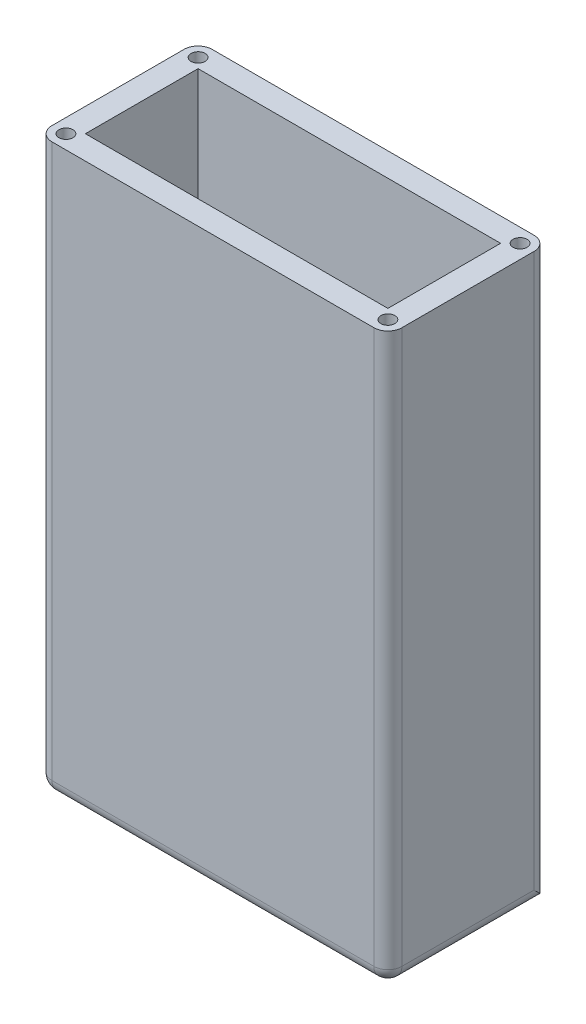
ISO-10303-21;
HEADER;
FILE_DESCRIPTION(('STEP AP214'),'2;1');
FILE_NAME('part.step','',(''),(''),'','','');
FILE_SCHEMA(('AUTOMOTIVE_DESIGN { 1 0 10303 214 1 1 1 1 }'));
ENDSEC;
DATA;
#1=APPLICATION_CONTEXT('core data for automotive mechanical design processes');
#2=APPLICATION_PROTOCOL_DEFINITION('international standard','automotive_design',2000,#1);
#3=PRODUCT_CONTEXT('',#1,'mechanical');
#4=PRODUCT('Part','Part','',(#3));
#5=PRODUCT_RELATED_PRODUCT_CATEGORY('part','',(#4));
#6=PRODUCT_DEFINITION_FORMATION('','',#4);
#7=PRODUCT_DEFINITION_CONTEXT('part definition',#1,'design');
#8=PRODUCT_DEFINITION('design','',#6,#7);
#9=PRODUCT_DEFINITION_SHAPE('','',#8);
#10=(LENGTH_UNIT() NAMED_UNIT(*) SI_UNIT(.MILLI.,.METRE.));
#11=(NAMED_UNIT(*) PLANE_ANGLE_UNIT() SI_UNIT($,.RADIAN.));
#12=(NAMED_UNIT(*) SI_UNIT($,.STERADIAN.) SOLID_ANGLE_UNIT());
#13=UNCERTAINTY_MEASURE_WITH_UNIT(LENGTH_MEASURE(1.E-05),#10,'distance_accuracy_value','');
#14=(GEOMETRIC_REPRESENTATION_CONTEXT(3) GLOBAL_UNCERTAINTY_ASSIGNED_CONTEXT((#13)) GLOBAL_UNIT_ASSIGNED_CONTEXT((#10,
#11,#12)) REPRESENTATION_CONTEXT('',''));
#15=CARTESIAN_POINT('',(0.,0.,0.));
#16=DIRECTION('',(0.,0.,1.));
#17=DIRECTION('',(1.,0.,0.));
#18=AXIS2_PLACEMENT_3D('',#15,#16,#17);
#19=CARTESIAN_POINT('',(0.,87.122,-34.29));
#20=DIRECTION('',(0.,0.,1.));
#21=DIRECTION('',(1.,0.,0.));
#22=AXIS2_PLACEMENT_3D('',#19,#20,#21);
#23=PLANE('',#22);
#24=DIRECTION('',(-1.,0.,0.));
#25=VECTOR('',#24,1.);
#26=CARTESIAN_POINT('',(0.,121.412,-34.29));
#27=LINE('',#26,#25);
#28=CARTESIAN_POINT('',(71.93,121.412,-34.29));
#29=VERTEX_POINT('',#28);
#30=CARTESIAN_POINT('',(3.,121.412,-34.29));
#31=VERTEX_POINT('',#30);
#32=EDGE_CURVE('E260',#29,#31,#27,.T.);
#33=ORIENTED_EDGE('',*,*,#32,.F.);
#34=DIRECTION('',(0.,-1.,0.));
#35=VECTOR('',#34,1.);
#36=CARTESIAN_POINT('',(71.93,87.122,-34.29));
#37=LINE('',#36,#35);
#38=CARTESIAN_POINT('',(71.93,84.582,-34.29));
#39=VERTEX_POINT('',#38);
#40=EDGE_CURVE('E328',#29,#39,#37,.T.);
#41=ORIENTED_EDGE('',*,*,#40,.T.);
#42=DIRECTION('',(-1.,0.,0.));
#43=VECTOR('',#42,1.);
#44=CARTESIAN_POINT('',(0.,84.582,-34.29));
#45=LINE('',#44,#43);
#46=CARTESIAN_POINT('',(3.,84.582,-34.29));
#47=VERTEX_POINT('',#46);
#48=EDGE_CURVE('E279',#39,#47,#45,.T.);
#49=ORIENTED_EDGE('',*,*,#48,.T.);
#50=DIRECTION('',(0.,-1.,0.));
#51=VECTOR('',#50,1.);
#52=CARTESIAN_POINT('',(3.,87.122,-34.29));
#53=LINE('',#52,#51);
#54=EDGE_CURVE('E322',#47,#31,#53,.F.);
#55=ORIENTED_EDGE('',*,*,#54,.T.);
#56=EDGE_LOOP('',(#33,#41,#49,#55));
#57=FACE_BOUND('',#56,.T.);
#58=ADVANCED_FACE('F33',(#57),#23,.F.);
#59=CARTESIAN_POINT('',(0.,89.662,0.));
#60=DIRECTION('',(0.,-1.,0.));
#61=DIRECTION('',(0.,0.,-1.));
#62=AXIS2_PLACEMENT_3D('',#59,#60,#61);
#63=PLANE('',#62);
#64=DIRECTION('',(0.,0.,-1.));
#65=VECTOR('',#64,1.);
#66=CARTESIAN_POINT('',(34.925,89.662,-5.08));
#67=LINE('',#66,#65);
#68=CARTESIAN_POINT('',(34.925,89.662,-5.08));
#69=VERTEX_POINT('',#68);
#70=CARTESIAN_POINT('',(34.925,89.662,-14.605));
#71=VERTEX_POINT('',#70);
#72=EDGE_CURVE('E220',#69,#71,#67,.T.);
#73=ORIENTED_EDGE('',*,*,#72,.F.);
#74=DIRECTION('',(1.,0.,0.));
#75=VECTOR('',#74,1.);
#76=CARTESIAN_POINT('',(0.,89.662,-5.08));
#77=LINE('',#76,#75);
#78=CARTESIAN_POINT('',(69.85,89.662,-5.08));
#79=VERTEX_POINT('',#78);
#80=EDGE_CURVE('E233',#69,#79,#77,.T.);
#81=ORIENTED_EDGE('',*,*,#80,.T.);
#82=DIRECTION('',(0.,0.,-1.));
#83=VECTOR('',#82,1.);
#84=CARTESIAN_POINT('',(69.85,89.662,0.));
#85=LINE('',#84,#83);
#86=CARTESIAN_POINT('',(69.85,89.662,-12.08));
#87=VERTEX_POINT('',#86);
#88=EDGE_CURVE('E244',#79,#87,#85,.T.);
#89=ORIENTED_EDGE('',*,*,#88,.T.);
#90=DIRECTION('',(1.,0.,0.));
#91=VECTOR('',#90,1.);
#92=CARTESIAN_POINT('',(69.85,89.662,-12.08));
#93=LINE('',#92,#91);
#94=CARTESIAN_POINT('',(64.85,89.662,-12.08));
#95=VERTEX_POINT('',#94);
#96=EDGE_CURVE('E393',#95,#87,#93,.T.);
#97=ORIENTED_EDGE('',*,*,#96,.F.);
#98=DIRECTION('',(0.,0.,1.));
#99=VECTOR('',#98,1.);
#100=CARTESIAN_POINT('',(64.85,89.662,-22.21));
#101=LINE('',#100,#99);
#102=CARTESIAN_POINT('',(64.85,89.662,-22.21));
#103=VERTEX_POINT('',#102);
#104=EDGE_CURVE('E408',#103,#95,#101,.T.);
#105=ORIENTED_EDGE('',*,*,#104,.F.);
#106=DIRECTION('',(-1.,0.,0.));
#107=VECTOR('',#106,1.);
#108=CARTESIAN_POINT('',(69.85,89.662,-22.21));
#109=LINE('',#108,#107);
#110=CARTESIAN_POINT('',(69.85,89.662,-22.21));
#111=VERTEX_POINT('',#110);
#112=EDGE_CURVE('E410',#111,#103,#109,.T.);
#113=ORIENTED_EDGE('',*,*,#112,.F.);
#114=CARTESIAN_POINT('',(69.85,89.662,-29.21));
#115=VERTEX_POINT('',#114);
#116=EDGE_CURVE('E248',#111,#115,#85,.T.);
#117=ORIENTED_EDGE('',*,*,#116,.T.);
#118=DIRECTION('',(-1.,0.,0.));
#119=VECTOR('',#118,1.);
#120=CARTESIAN_POINT('',(0.,89.662,-29.21));
#121=LINE('',#120,#119);
#122=CARTESIAN_POINT('',(5.08,89.662,-29.21));
#123=VERTEX_POINT('',#122);
#124=EDGE_CURVE('E432',#115,#123,#121,.T.);
#125=ORIENTED_EDGE('',*,*,#124,.T.);
#126=DIRECTION('',(0.,0.,-1.));
#127=VECTOR('',#126,1.);
#128=CARTESIAN_POINT('',(5.08,89.662,0.));
#129=LINE('',#128,#127);
#130=CARTESIAN_POINT('',(5.08,89.662,-5.08));
#131=VERTEX_POINT('',#130);
#132=EDGE_CURVE('E441',#131,#123,#129,.T.);
#133=ORIENTED_EDGE('',*,*,#132,.F.);
#134=CARTESIAN_POINT('',(22.225,89.662,-5.08));
#135=VERTEX_POINT('',#134);
#136=EDGE_CURVE('E243',#131,#135,#77,.T.);
#137=ORIENTED_EDGE('',*,*,#136,.T.);
#138=DIRECTION('',(0.,0.,1.));
#139=VECTOR('',#138,1.);
#140=CARTESIAN_POINT('',(22.225,89.662,-5.08));
#141=LINE('',#140,#139);
#142=CARTESIAN_POINT('',(22.225,89.662,-14.605));
#143=VERTEX_POINT('',#142);
#144=EDGE_CURVE('E386',#143,#135,#141,.T.);
#145=ORIENTED_EDGE('',*,*,#144,.F.);
#146=DIRECTION('',(-1.,0.,0.));
#147=VECTOR('',#146,1.);
#148=CARTESIAN_POINT('',(34.925,89.662,-14.605));
#149=LINE('',#148,#147);
#150=EDGE_CURVE('E236',#71,#143,#149,.T.);
#151=ORIENTED_EDGE('',*,*,#150,.F.);
#152=EDGE_LOOP('',(#73,#81,#89,#97,#105,#113,#117,#125,#133,#137,#145,#151));
#153=FACE_BOUND('',#152,.T.);
#154=ADVANCED_FACE('F231',(#153),#63,.F.);
#155=CARTESIAN_POINT('',(0.,121.412,0.));
#156=DIRECTION('',(0.,-1.,0.));
#157=DIRECTION('',(0.,0.,-1.));
#158=AXIS2_PLACEMENT_3D('',#155,#156,#157);
#159=PLANE('',#158);
#160=CARTESIAN_POINT('',(71.93,121.412,-31.29));
#161=DIRECTION('',(0.,1.,0.));
#162=DIRECTION('',(0.,0.,1.));
#163=AXIS2_PLACEMENT_3D('',#160,#161,#162);
#164=CIRCLE('',#163,1.5);
#165=CARTESIAN_POINT('',(71.93,121.412,-29.79));
#166=VERTEX_POINT('',#165);
#167=EDGE_CURVE('E359',#166,#166,#164,.T.);
#168=ORIENTED_EDGE('',*,*,#167,.F.);
#169=EDGE_LOOP('',(#168));
#170=FACE_BOUND('',#169,.T.);
#171=CARTESIAN_POINT('',(71.93,121.412,-3.));
#172=DIRECTION('',(0.,1.,0.));
#173=DIRECTION('',(0.,0.,1.));
#174=AXIS2_PLACEMENT_3D('',#171,#172,#173);
#175=CIRCLE('',#174,1.5);
#176=CARTESIAN_POINT('',(71.93,121.412,-1.5));
#177=VERTEX_POINT('',#176);
#178=EDGE_CURVE('E370',#177,#177,#175,.T.);
#179=ORIENTED_EDGE('',*,*,#178,.F.);
#180=EDGE_LOOP('',(#179));
#181=FACE_BOUND('',#180,.T.);
#182=CARTESIAN_POINT('',(3.,121.412,-3.));
#183=DIRECTION('',(0.,1.,0.));
#184=DIRECTION('',(0.,0.,1.));
#185=AXIS2_PLACEMENT_3D('',#182,#183,#184);
#186=CIRCLE('',#185,1.5);
#187=CARTESIAN_POINT('',(3.,121.412,-1.5));
#188=VERTEX_POINT('',#187);
#189=EDGE_CURVE('E632',#188,#188,#186,.T.);
#190=ORIENTED_EDGE('',*,*,#189,.F.);
#191=EDGE_LOOP('',(#190));
#192=FACE_BOUND('',#191,.T.);
#193=CARTESIAN_POINT('',(3.,121.412,-31.29));
#194=DIRECTION('',(0.,1.,0.));
#195=DIRECTION('',(0.,0.,1.));
#196=AXIS2_PLACEMENT_3D('',#193,#194,#195);
#197=CIRCLE('',#196,1.5);
#198=CARTESIAN_POINT('',(3.,121.412,-29.79));
#199=VERTEX_POINT('',#198);
#200=EDGE_CURVE('E378',#199,#199,#197,.T.);
#201=ORIENTED_EDGE('',*,*,#200,.F.);
#202=EDGE_LOOP('',(#201));
#203=FACE_BOUND('',#202,.T.);
#204=DIRECTION('',(1.,0.,0.));
#205=VECTOR('',#204,1.);
#206=CARTESIAN_POINT('',(0.,121.412,0.));
#207=LINE('',#206,#205);
#208=CARTESIAN_POINT('',(3.,121.412,0.));
#209=VERTEX_POINT('',#208);
#210=CARTESIAN_POINT('',(71.93,121.412,0.));
#211=VERTEX_POINT('',#210);
#212=EDGE_CURVE('E254',#209,#211,#207,.T.);
#213=ORIENTED_EDGE('',*,*,#212,.T.);
#214=CARTESIAN_POINT('',(71.93,121.412,-3.));
#215=DIRECTION('',(0.,-1.,0.));
#216=DIRECTION('',(0.,0.,-1.));
#217=AXIS2_PLACEMENT_3D('',#214,#215,#216);
#218=CIRCLE('',#217,3.);
#219=CARTESIAN_POINT('',(74.93,121.412,-3.));
#220=VERTEX_POINT('',#219);
#221=EDGE_CURVE('E308',#211,#220,#218,.F.);
#222=ORIENTED_EDGE('',*,*,#221,.T.);
#223=DIRECTION('',(0.,0.,-1.));
#224=VECTOR('',#223,1.);
#225=CARTESIAN_POINT('',(74.93,121.412,0.));
#226=LINE('',#225,#224);
#227=CARTESIAN_POINT('',(74.93,121.412,-31.29));
#228=VERTEX_POINT('',#227);
#229=EDGE_CURVE('E257',#220,#228,#226,.T.);
#230=ORIENTED_EDGE('',*,*,#229,.T.);
#231=CARTESIAN_POINT('',(71.93,121.412,-31.29));
#232=DIRECTION('',(0.,-1.,0.));
#233=DIRECTION('',(0.,0.,-1.));
#234=AXIS2_PLACEMENT_3D('',#231,#232,#233);
#235=CIRCLE('',#234,3.);
#236=EDGE_CURVE('E304',#228,#29,#235,.F.);
#237=ORIENTED_EDGE('',*,*,#236,.T.);
#238=ORIENTED_EDGE('',*,*,#32,.T.);
#239=CARTESIAN_POINT('',(3.,121.412,-31.29));
#240=DIRECTION('',(0.,-1.,0.));
#241=DIRECTION('',(0.,0.,-1.));
#242=AXIS2_PLACEMENT_3D('',#239,#240,#241);
#243=CIRCLE('',#242,3.);
#244=CARTESIAN_POINT('',(0.,121.412,-31.29));
#245=VERTEX_POINT('',#244);
#246=EDGE_CURVE('E302',#31,#245,#243,.F.);
#247=ORIENTED_EDGE('',*,*,#246,.T.);
#248=DIRECTION('',(0.,0.,1.));
#249=VECTOR('',#248,1.);
#250=CARTESIAN_POINT('',(0.,121.412,0.));
#251=LINE('',#250,#249);
#252=CARTESIAN_POINT('',(0.,121.412,-3.));
#253=VERTEX_POINT('',#252);
#254=EDGE_CURVE('E247',#245,#253,#251,.T.);
#255=ORIENTED_EDGE('',*,*,#254,.T.);
#256=CARTESIAN_POINT('',(3.,121.412,-3.));
#257=DIRECTION('',(0.,-1.,0.));
#258=DIRECTION('',(0.,0.,-1.));
#259=AXIS2_PLACEMENT_3D('',#256,#257,#258);
#260=CIRCLE('',#259,3.);
#261=EDGE_CURVE('E306',#253,#209,#260,.F.);
#262=ORIENTED_EDGE('',*,*,#261,.T.);
#263=EDGE_LOOP('',(#213,#222,#230,#237,#238,#247,#255,#262));
#264=FACE_BOUND('',#263,.T.);
#265=DIRECTION('',(0.,0.,1.));
#266=VECTOR('',#265,1.);
#267=CARTESIAN_POINT('',(5.08,121.412,0.));
#268=LINE('',#267,#266);
#269=CARTESIAN_POINT('',(5.08,121.412,-29.21));
#270=VERTEX_POINT('',#269);
#271=CARTESIAN_POINT('',(5.08,121.412,-5.08));
#272=VERTEX_POINT('',#271);
#273=EDGE_CURVE('E389',#270,#272,#268,.T.);
#274=ORIENTED_EDGE('',*,*,#273,.F.);
#275=DIRECTION('',(-1.,0.,0.));
#276=VECTOR('',#275,1.);
#277=CARTESIAN_POINT('',(0.,121.412,-29.21));
#278=LINE('',#277,#276);
#279=CARTESIAN_POINT('',(69.85,121.412,-29.21));
#280=VERTEX_POINT('',#279);
#281=EDGE_CURVE('E437',#280,#270,#278,.T.);
#282=ORIENTED_EDGE('',*,*,#281,.F.);
#283=DIRECTION('',(0.,0.,-1.));
#284=VECTOR('',#283,1.);
#285=CARTESIAN_POINT('',(69.85,121.412,0.));
#286=LINE('',#285,#284);
#287=CARTESIAN_POINT('',(69.85,121.412,-5.08));
#288=VERTEX_POINT('',#287);
#289=EDGE_CURVE('E445',#288,#280,#286,.T.);
#290=ORIENTED_EDGE('',*,*,#289,.F.);
#291=DIRECTION('',(1.,0.,0.));
#292=VECTOR('',#291,1.);
#293=CARTESIAN_POINT('',(0.,121.412,-5.08));
#294=LINE('',#293,#292);
#295=EDGE_CURVE('E448',#272,#288,#294,.T.);
#296=ORIENTED_EDGE('',*,*,#295,.F.);
#297=EDGE_LOOP('',(#274,#282,#290,#296));
#298=FACE_BOUND('',#297,.T.);
#299=ADVANCED_FACE('F467',(#170,#181,#192,#203,#264,#298),#159,.F.);
#300=DIRECTION('',(-1.,0.,0.));
#301=VECTOR('',#300,1.);
#302=CARTESIAN_POINT('',(0.,2.54,-34.29));
#303=LINE('',#302,#301);
#304=CARTESIAN_POINT('',(71.93,2.54,-34.29));
#305=VERTEX_POINT('',#304);
#306=CARTESIAN_POINT('',(3.,2.54,-34.29));
#307=VERTEX_POINT('',#306);
#308=EDGE_CURVE('E274',#305,#307,#303,.T.);
#309=ORIENTED_EDGE('',*,*,#308,.F.);
#310=DIRECTION('',(0.,-1.,0.));
#311=VECTOR('',#310,1.);
#312=CARTESIAN_POINT('',(71.93,87.122,-34.29));
#313=LINE('',#312,#311);
#314=CARTESIAN_POINT('',(71.93,0.,-34.29));
#315=VERTEX_POINT('',#314);
#316=EDGE_CURVE('E326',#305,#315,#313,.T.);
#317=ORIENTED_EDGE('',*,*,#316,.T.);
#318=DIRECTION('',(-1.,0.,0.));
#319=VECTOR('',#318,1.);
#320=CARTESIAN_POINT('',(0.,0.,-34.29));
#321=LINE('',#320,#319);
#322=CARTESIAN_POINT('',(3.,0.,-34.29));
#323=VERTEX_POINT('',#322);
#324=EDGE_CURVE('E269',#315,#323,#321,.T.);
#325=ORIENTED_EDGE('',*,*,#324,.T.);
#326=DIRECTION('',(0.,-1.,0.));
#327=VECTOR('',#326,1.);
#328=CARTESIAN_POINT('',(3.,87.122,-34.29));
#329=LINE('',#328,#327);
#330=EDGE_CURVE('E324',#323,#307,#329,.F.);
#331=ORIENTED_EDGE('',*,*,#330,.T.);
#332=EDGE_LOOP('',(#309,#317,#325,#331));
#333=FACE_BOUND('',#332,.T.);
#334=ADVANCED_FACE('F499',(#333),#23,.F.);
#335=CARTESIAN_POINT('',(0.,87.122,0.));
#336=DIRECTION('',(1.,0.,0.));
#337=DIRECTION('',(0.,0.,-1.));
#338=AXIS2_PLACEMENT_3D('',#335,#336,#337);
#339=PLANE('',#338);
#340=DIRECTION('',(0.,0.,1.));
#341=VECTOR('',#340,1.);
#342=CARTESIAN_POINT('',(0.,3.,0.));
#343=LINE('',#342,#341);
#344=CARTESIAN_POINT('',(0.,3.,-31.29));
#345=VERTEX_POINT('',#344);
#346=CARTESIAN_POINT('',(0.,3.,-3.));
#347=VERTEX_POINT('',#346);
#348=EDGE_CURVE('E310',#345,#347,#343,.T.);
#349=ORIENTED_EDGE('',*,*,#348,.T.);
#350=DIRECTION('',(0.,-1.,0.));
#351=VECTOR('',#350,1.);
#352=CARTESIAN_POINT('',(0.,87.122,-3.));
#353=LINE('',#352,#351);
#354=EDGE_CURVE('E314',#347,#253,#353,.F.);
#355=ORIENTED_EDGE('',*,*,#354,.T.);
#356=ORIENTED_EDGE('',*,*,#254,.F.);
#357=DIRECTION('',(0.,-1.,0.));
#358=VECTOR('',#357,1.);
#359=CARTESIAN_POINT('',(0.,87.122,-31.29));
#360=LINE('',#359,#358);
#361=EDGE_CURVE('E312',#245,#345,#360,.T.);
#362=ORIENTED_EDGE('',*,*,#361,.T.);
#363=EDGE_LOOP('',(#349,#355,#356,#362));
#364=FACE_BOUND('',#363,.T.);
#365=ADVANCED_FACE('F529',(#364),#339,.F.);
#366=CARTESIAN_POINT('',(0.,87.122,0.));
#367=DIRECTION('',(0.,0.,-1.));
#368=DIRECTION('',(-1.,0.,0.));
#369=AXIS2_PLACEMENT_3D('',#366,#367,#368);
#370=PLANE('',#369);
#371=DIRECTION('',(1.,0.,0.));
#372=VECTOR('',#371,1.);
#373=CARTESIAN_POINT('',(74.93,3.,0.));
#374=LINE('',#373,#372);
#375=CARTESIAN_POINT('',(3.,3.,0.));
#376=VERTEX_POINT('',#375);
#377=CARTESIAN_POINT('',(71.93,3.,0.));
#378=VERTEX_POINT('',#377);
#379=EDGE_CURVE('E296',#376,#378,#374,.T.);
#380=ORIENTED_EDGE('',*,*,#379,.T.);
#381=DIRECTION('',(0.,-1.,0.));
#382=VECTOR('',#381,1.);
#383=CARTESIAN_POINT('',(71.93,87.122,0.));
#384=LINE('',#383,#382);
#385=EDGE_CURVE('E300',#378,#211,#384,.F.);
#386=ORIENTED_EDGE('',*,*,#385,.T.);
#387=ORIENTED_EDGE('',*,*,#212,.F.);
#388=DIRECTION('',(0.,-1.,0.));
#389=VECTOR('',#388,1.);
#390=CARTESIAN_POINT('',(3.,87.122,0.));
#391=LINE('',#390,#389);
#392=EDGE_CURVE('E298',#209,#376,#391,.T.);
#393=ORIENTED_EDGE('',*,*,#392,.T.);
#394=EDGE_LOOP('',(#380,#386,#387,#393));
#395=FACE_BOUND('',#394,.T.);
#396=ADVANCED_FACE('F534',(#395),#370,.F.);
#397=CARTESIAN_POINT('',(74.93,87.122,0.));
#398=DIRECTION('',(-1.,0.,0.));
#399=DIRECTION('',(0.,0.,1.));
#400=AXIS2_PLACEMENT_3D('',#397,#398,#399);
#401=PLANE('',#400);
#402=ORIENTED_EDGE('',*,*,#229,.F.);
#403=DIRECTION('',(0.,-1.,0.));
#404=VECTOR('',#403,1.);
#405=CARTESIAN_POINT('',(74.93,87.122,-3.));
#406=LINE('',#405,#404);
#407=CARTESIAN_POINT('',(74.93,3.,-3.));
#408=VERTEX_POINT('',#407);
#409=EDGE_CURVE('E293',#220,#408,#406,.T.);
#410=ORIENTED_EDGE('',*,*,#409,.T.);
#411=DIRECTION('',(0.,0.,-1.));
#412=VECTOR('',#411,1.);
#413=CARTESIAN_POINT('',(74.93,3.,-34.29));
#414=LINE('',#413,#412);
#415=CARTESIAN_POINT('',(74.93,3.,-31.29));
#416=VERTEX_POINT('',#415);
#417=EDGE_CURVE('E289',#408,#416,#414,.T.);
#418=ORIENTED_EDGE('',*,*,#417,.T.);
#419=DIRECTION('',(0.,-1.,0.));
#420=VECTOR('',#419,1.);
#421=CARTESIAN_POINT('',(74.93,87.122,-31.29));
#422=LINE('',#421,#420);
#423=EDGE_CURVE('E291',#416,#228,#422,.F.);
#424=ORIENTED_EDGE('',*,*,#423,.T.);
#425=EDGE_LOOP('',(#402,#410,#418,#424));
#426=FACE_BOUND('',#425,.T.);
#427=ADVANCED_FACE('F549',(#426),#401,.F.);
#428=CARTESIAN_POINT('',(0.,0.,0.));
#429=DIRECTION('',(0.,-1.,0.));
#430=DIRECTION('',(0.,0.,-1.));
#431=AXIS2_PLACEMENT_3D('',#428,#429,#430);
#432=PLANE('',#431);
#433=ORIENTED_EDGE('',*,*,#324,.F.);
#434=DIRECTION('',(0.,0.,-1.));
#435=VECTOR('',#434,1.);
#436=CARTESIAN_POINT('',(71.93,0.,0.));
#437=LINE('',#436,#435);
#438=CARTESIAN_POINT('',(71.93,0.,-3.));
#439=VERTEX_POINT('',#438);
#440=EDGE_CURVE('E320',#315,#439,#437,.F.);
#441=ORIENTED_EDGE('',*,*,#440,.T.);
#442=DIRECTION('',(1.,0.,0.));
#443=VECTOR('',#442,1.);
#444=CARTESIAN_POINT('',(0.,0.,-3.));
#445=LINE('',#444,#443);
#446=CARTESIAN_POINT('',(3.,0.,-3.));
#447=VERTEX_POINT('',#446);
#448=EDGE_CURVE('E318',#439,#447,#445,.F.);
#449=ORIENTED_EDGE('',*,*,#448,.T.);
#450=DIRECTION('',(0.,0.,1.));
#451=VECTOR('',#450,1.);
#452=CARTESIAN_POINT('',(3.,0.,-34.29));
#453=LINE('',#452,#451);
#454=EDGE_CURVE('E316',#447,#323,#453,.F.);
#455=ORIENTED_EDGE('',*,*,#454,.T.);
#456=EDGE_LOOP('',(#433,#441,#449,#455));
#457=FACE_BOUND('',#456,.T.);
#458=ADVANCED_FACE('F545',(#457),#432,.T.);
#459=CARTESIAN_POINT('',(2.54,87.122,0.));
#460=DIRECTION('',(1.,0.,0.));
#461=DIRECTION('',(0.,0.,-1.));
#462=AXIS2_PLACEMENT_3D('',#459,#460,#461);
#463=PLANE('',#462);
#464=DIRECTION('',(0.,0.,1.));
#465=VECTOR('',#464,1.);
#466=CARTESIAN_POINT('',(2.54,2.54,0.));
#467=LINE('',#466,#465);
#468=CARTESIAN_POINT('',(2.54,2.54,-34.2545235704915));
#469=VERTEX_POINT('',#468);
#470=CARTESIAN_POINT('',(2.54,2.54,-2.54));
#471=VERTEX_POINT('',#470);
#472=EDGE_CURVE('E263',#469,#471,#467,.T.);
#473=ORIENTED_EDGE('',*,*,#472,.F.);
#474=DIRECTION('',(0.,-1.,0.));
#475=VECTOR('',#474,1.);
#476=CARTESIAN_POINT('',(2.54,2.54,-34.2545235704915));
#477=LINE('',#476,#475);
#478=CARTESIAN_POINT('',(2.54,84.582,-34.2545235704915));
#479=VERTEX_POINT('',#478);
#480=EDGE_CURVE('E11',#469,#479,#477,.F.);
#481=ORIENTED_EDGE('',*,*,#480,.T.);
#482=DIRECTION('',(0.,0.,1.));
#483=VECTOR('',#482,1.);
#484=CARTESIAN_POINT('',(2.54,84.582,0.));
#485=LINE('',#484,#483);
#486=CARTESIAN_POINT('',(2.54,84.582,-2.54));
#487=VERTEX_POINT('',#486);
#488=EDGE_CURVE('E271',#479,#487,#485,.T.);
#489=ORIENTED_EDGE('',*,*,#488,.T.);
#490=DIRECTION('',(0.,-1.,0.));
#491=VECTOR('',#490,1.);
#492=CARTESIAN_POINT('',(2.54,87.122,-2.54));
#493=LINE('',#492,#491);
#494=EDGE_CURVE('E266',#487,#471,#493,.T.);
#495=ORIENTED_EDGE('',*,*,#494,.T.);
#496=EDGE_LOOP('',(#473,#481,#489,#495));
#497=FACE_BOUND('',#496,.T.);
#498=ADVANCED_FACE('F506',(#497),#463,.T.);
#499=CARTESIAN_POINT('',(0.,87.122,-2.54));
#500=DIRECTION('',(0.,0.,-1.));
#501=DIRECTION('',(-1.,0.,0.));
#502=AXIS2_PLACEMENT_3D('',#499,#500,#501);
#503=PLANE('',#502);
#504=DIRECTION('',(1.,0.,0.));
#505=VECTOR('',#504,1.);
#506=CARTESIAN_POINT('',(0.,2.54,-2.54));
#507=LINE('',#506,#505);
#508=CARTESIAN_POINT('',(72.39,2.54,-2.54));
#509=VERTEX_POINT('',#508);
#510=EDGE_CURVE('E265',#471,#509,#507,.T.);
#511=ORIENTED_EDGE('',*,*,#510,.F.);
#512=ORIENTED_EDGE('',*,*,#494,.F.);
#513=DIRECTION('',(1.,0.,0.));
#514=VECTOR('',#513,1.);
#515=CARTESIAN_POINT('',(0.,84.582,-2.54));
#516=LINE('',#515,#514);
#517=CARTESIAN_POINT('',(72.39,84.582,-2.54));
#518=VERTEX_POINT('',#517);
#519=EDGE_CURVE('E273',#487,#518,#516,.T.);
#520=ORIENTED_EDGE('',*,*,#519,.T.);
#521=DIRECTION('',(0.,-1.,0.));
#522=VECTOR('',#521,1.);
#523=CARTESIAN_POINT('',(72.39,87.122,-2.54));
#524=LINE('',#523,#522);
#525=EDGE_CURVE('E270',#518,#509,#524,.T.);
#526=ORIENTED_EDGE('',*,*,#525,.T.);
#527=EDGE_LOOP('',(#511,#512,#520,#526));
#528=FACE_BOUND('',#527,.T.);
#529=ADVANCED_FACE('F512',(#528),#503,.T.);
#530=CARTESIAN_POINT('',(72.39,87.122,0.));
#531=DIRECTION('',(-1.,0.,0.));
#532=DIRECTION('',(0.,0.,1.));
#533=AXIS2_PLACEMENT_3D('',#530,#531,#532);
#534=PLANE('',#533);
#535=DIRECTION('',(0.,0.,-1.));
#536=VECTOR('',#535,1.);
#537=CARTESIAN_POINT('',(72.39,84.582,0.));
#538=LINE('',#537,#536);
#539=CARTESIAN_POINT('',(72.39,84.582,-34.2545235704915));
#540=VERTEX_POINT('',#539);
#541=EDGE_CURVE('E281',#518,#540,#538,.T.);
#542=ORIENTED_EDGE('',*,*,#541,.T.);
#543=DIRECTION('',(0.,-1.,0.));
#544=VECTOR('',#543,1.);
#545=CARTESIAN_POINT('',(72.39,84.582,-34.2545235704915));
#546=LINE('',#545,#544);
#547=CARTESIAN_POINT('',(72.39,2.54,-34.2545235704915));
#548=VERTEX_POINT('',#547);
#549=EDGE_CURVE('E58',#540,#548,#546,.T.);
#550=ORIENTED_EDGE('',*,*,#549,.T.);
#551=DIRECTION('',(0.,0.,-1.));
#552=VECTOR('',#551,1.);
#553=CARTESIAN_POINT('',(72.39,2.54,0.));
#554=LINE('',#553,#552);
#555=EDGE_CURVE('E276',#509,#548,#554,.T.);
#556=ORIENTED_EDGE('',*,*,#555,.F.);
#557=ORIENTED_EDGE('',*,*,#525,.F.);
#558=EDGE_LOOP('',(#542,#550,#556,#557));
#559=FACE_BOUND('',#558,.T.);
#560=ADVANCED_FACE('F480',(#559),#534,.T.);
#561=CARTESIAN_POINT('',(0.,84.582,0.));
#562=DIRECTION('',(0.,-1.,0.));
#563=DIRECTION('',(0.,0.,-1.));
#564=AXIS2_PLACEMENT_3D('',#561,#562,#563);
#565=PLANE('',#564);
#566=DIRECTION('',(0.,0.,-1.));
#567=VECTOR('',#566,1.);
#568=CARTESIAN_POINT('',(34.925,84.582,-5.08));
#569=LINE('',#568,#567);
#570=CARTESIAN_POINT('',(34.925,84.582,-5.08));
#571=VERTEX_POINT('',#570);
#572=CARTESIAN_POINT('',(34.925,84.582,-14.605));
#573=VERTEX_POINT('',#572);
#574=EDGE_CURVE('E223',#571,#573,#569,.T.);
#575=ORIENTED_EDGE('',*,*,#574,.T.);
#576=DIRECTION('',(-1.,0.,0.));
#577=VECTOR('',#576,1.);
#578=CARTESIAN_POINT('',(34.925,84.582,-14.605));
#579=LINE('',#578,#577);
#580=CARTESIAN_POINT('',(22.225,84.582,-14.605));
#581=VERTEX_POINT('',#580);
#582=EDGE_CURVE('E382',#573,#581,#579,.T.);
#583=ORIENTED_EDGE('',*,*,#582,.T.);
#584=DIRECTION('',(0.,0.,1.));
#585=VECTOR('',#584,1.);
#586=CARTESIAN_POINT('',(22.225,84.582,-5.08));
#587=LINE('',#586,#585);
#588=CARTESIAN_POINT('',(22.225,84.582,-5.08));
#589=VERTEX_POINT('',#588);
#590=EDGE_CURVE('E227',#581,#589,#587,.T.);
#591=ORIENTED_EDGE('',*,*,#590,.T.);
#592=DIRECTION('',(1.,0.,0.));
#593=VECTOR('',#592,1.);
#594=CARTESIAN_POINT('',(34.925,84.582,-5.08));
#595=LINE('',#594,#593);
#596=EDGE_CURVE('E228',#589,#571,#595,.T.);
#597=ORIENTED_EDGE('',*,*,#596,.T.);
#598=EDGE_LOOP('',(#575,#583,#591,#597));
#599=FACE_BOUND('',#598,.T.);
#600=DIRECTION('',(0.,0.,-1.));
#601=VECTOR('',#600,1.);
#602=CARTESIAN_POINT('',(69.85,84.582,-22.21));
#603=LINE('',#602,#601);
#604=CARTESIAN_POINT('',(69.85,84.582,-12.08));
#605=VERTEX_POINT('',#604);
#606=CARTESIAN_POINT('',(69.85,84.582,-22.21));
#607=VERTEX_POINT('',#606);
#608=EDGE_CURVE('E377',#605,#607,#603,.T.);
#609=ORIENTED_EDGE('',*,*,#608,.T.);
#610=DIRECTION('',(-1.,0.,0.));
#611=VECTOR('',#610,1.);
#612=CARTESIAN_POINT('',(69.85,84.582,-22.21));
#613=LINE('',#612,#611);
#614=CARTESIAN_POINT('',(64.85,84.582,-22.21));
#615=VERTEX_POINT('',#614);
#616=EDGE_CURVE('E401',#607,#615,#613,.T.);
#617=ORIENTED_EDGE('',*,*,#616,.T.);
#618=DIRECTION('',(0.,0.,1.));
#619=VECTOR('',#618,1.);
#620=CARTESIAN_POINT('',(64.85,84.582,-22.21));
#621=LINE('',#620,#619);
#622=CARTESIAN_POINT('',(64.85,84.582,-12.08));
#623=VERTEX_POINT('',#622);
#624=EDGE_CURVE('E420',#615,#623,#621,.T.);
#625=ORIENTED_EDGE('',*,*,#624,.T.);
#626=DIRECTION('',(1.,0.,0.));
#627=VECTOR('',#626,1.);
#628=CARTESIAN_POINT('',(69.85,84.582,-12.08));
#629=LINE('',#628,#627);
#630=EDGE_CURVE('E416',#623,#605,#629,.T.);
#631=ORIENTED_EDGE('',*,*,#630,.T.);
#632=EDGE_LOOP('',(#609,#617,#625,#631));
#633=FACE_BOUND('',#632,.T.);
#634=ORIENTED_EDGE('',*,*,#48,.F.);
#635=CARTESIAN_POINT('',(71.93,84.582,-31.29));
#636=DIRECTION('',(0.,-1.,0.));
#637=DIRECTION('',(0.,0.,-1.));
#638=AXIS2_PLACEMENT_3D('',#635,#636,#637);
#639=CIRCLE('',#638,3.);
#640=EDGE_CURVE('E332',#39,#540,#639,.T.);
#641=ORIENTED_EDGE('',*,*,#640,.T.);
#642=ORIENTED_EDGE('',*,*,#541,.F.);
#643=ORIENTED_EDGE('',*,*,#519,.F.);
#644=ORIENTED_EDGE('',*,*,#488,.F.);
#645=CARTESIAN_POINT('',(3.,84.582,-31.29));
#646=DIRECTION('',(0.,-1.,0.));
#647=DIRECTION('',(0.,0.,-1.));
#648=AXIS2_PLACEMENT_3D('',#645,#646,#647);
#649=CIRCLE('',#648,3.);
#650=EDGE_CURVE('E330',#479,#47,#649,.T.);
#651=ORIENTED_EDGE('',*,*,#650,.T.);
#652=EDGE_LOOP('',(#634,#641,#642,#643,#644,#651));
#653=FACE_BOUND('',#652,.T.);
#654=ADVANCED_FACE('F476',(#599,#633,#653),#565,.T.);
#655=CARTESIAN_POINT('',(0.,2.54,0.));
#656=DIRECTION('',(0.,-1.,0.));
#657=DIRECTION('',(0.,0.,-1.));
#658=AXIS2_PLACEMENT_3D('',#655,#656,#657);
#659=PLANE('',#658);
#660=ORIENTED_EDGE('',*,*,#555,.T.);
#661=CARTESIAN_POINT('',(71.93,2.54,-31.29));
#662=DIRECTION('',(0.,-1.,0.));
#663=DIRECTION('',(0.,0.,-1.));
#664=AXIS2_PLACEMENT_3D('',#661,#662,#663);
#665=CIRCLE('',#664,3.);
#666=EDGE_CURVE('E42',#548,#305,#665,.F.);
#667=ORIENTED_EDGE('',*,*,#666,.T.);
#668=ORIENTED_EDGE('',*,*,#308,.T.);
#669=CARTESIAN_POINT('',(3.,2.54,-31.29));
#670=DIRECTION('',(0.,-1.,0.));
#671=DIRECTION('',(0.,0.,-1.));
#672=AXIS2_PLACEMENT_3D('',#669,#670,#671);
#673=CIRCLE('',#672,3.);
#674=EDGE_CURVE('E50',#307,#469,#673,.F.);
#675=ORIENTED_EDGE('',*,*,#674,.T.);
#676=ORIENTED_EDGE('',*,*,#472,.T.);
#677=ORIENTED_EDGE('',*,*,#510,.T.);
#678=EDGE_LOOP('',(#660,#667,#668,#675,#676,#677));
#679=FACE_BOUND('',#678,.T.);
#680=ADVANCED_FACE('F479',(#679),#659,.F.);
#681=CARTESIAN_POINT('',(0.,87.122,-29.21));
#682=DIRECTION('',(0.,0.,1.));
#683=DIRECTION('',(1.,0.,0.));
#684=AXIS2_PLACEMENT_3D('',#681,#682,#683);
#685=PLANE('',#684);
#686=ORIENTED_EDGE('',*,*,#124,.F.);
#687=DIRECTION('',(0.,-1.,0.));
#688=VECTOR('',#687,1.);
#689=CARTESIAN_POINT('',(69.85,87.122,-29.21));
#690=LINE('',#689,#688);
#691=EDGE_CURVE('E431',#280,#115,#690,.T.);
#692=ORIENTED_EDGE('',*,*,#691,.F.);
#693=ORIENTED_EDGE('',*,*,#281,.T.);
#694=DIRECTION('',(0.,-1.,0.));
#695=VECTOR('',#694,1.);
#696=CARTESIAN_POINT('',(5.08,87.122,-29.21));
#697=LINE('',#696,#695);
#698=EDGE_CURVE('E428',#270,#123,#697,.T.);
#699=ORIENTED_EDGE('',*,*,#698,.T.);
#700=EDGE_LOOP('',(#686,#692,#693,#699));
#701=FACE_BOUND('',#700,.T.);
#702=ADVANCED_FACE('F460',(#701),#685,.T.);
#703=CARTESIAN_POINT('',(5.08,87.122,0.));
#704=DIRECTION('',(1.,0.,0.));
#705=DIRECTION('',(0.,0.,-1.));
#706=AXIS2_PLACEMENT_3D('',#703,#704,#705);
#707=PLANE('',#706);
#708=ORIENTED_EDGE('',*,*,#132,.T.);
#709=ORIENTED_EDGE('',*,*,#698,.F.);
#710=ORIENTED_EDGE('',*,*,#273,.T.);
#711=DIRECTION('',(0.,-1.,0.));
#712=VECTOR('',#711,1.);
#713=CARTESIAN_POINT('',(5.08,87.122,-5.08));
#714=LINE('',#713,#712);
#715=EDGE_CURVE('E438',#272,#131,#714,.T.);
#716=ORIENTED_EDGE('',*,*,#715,.T.);
#717=EDGE_LOOP('',(#708,#709,#710,#716));
#718=FACE_BOUND('',#717,.T.);
#719=ADVANCED_FACE('F468',(#718),#707,.T.);
#720=CARTESIAN_POINT('',(0.,87.122,-5.08));
#721=DIRECTION('',(0.,0.,-1.));
#722=DIRECTION('',(-1.,0.,0.));
#723=AXIS2_PLACEMENT_3D('',#720,#721,#722);
#724=PLANE('',#723);
#725=ORIENTED_EDGE('',*,*,#715,.F.);
#726=ORIENTED_EDGE('',*,*,#295,.T.);
#727=DIRECTION('',(0.,-1.,0.));
#728=VECTOR('',#727,1.);
#729=CARTESIAN_POINT('',(69.85,87.122,-5.08));
#730=LINE('',#729,#728);
#731=EDGE_CURVE('E242',#288,#79,#730,.T.);
#732=ORIENTED_EDGE('',*,*,#731,.T.);
#733=ORIENTED_EDGE('',*,*,#80,.F.);
#734=DIRECTION('',(0.,1.,0.));
#735=VECTOR('',#734,1.);
#736=CARTESIAN_POINT('',(34.925,-0.001000000000001,-5.08));
#737=LINE('',#736,#735);
#738=EDGE_CURVE('E216',#571,#69,#737,.T.);
#739=ORIENTED_EDGE('',*,*,#738,.F.);
#740=ORIENTED_EDGE('',*,*,#596,.F.);
#741=DIRECTION('',(0.,1.,0.));
#742=VECTOR('',#741,1.);
#743=CARTESIAN_POINT('',(22.225,-0.001000000000001,-5.08));
#744=LINE('',#743,#742);
#745=EDGE_CURVE('E385',#589,#135,#744,.T.);
#746=ORIENTED_EDGE('',*,*,#745,.T.);
#747=ORIENTED_EDGE('',*,*,#136,.F.);
#748=EDGE_LOOP('',(#725,#726,#732,#733,#739,#740,#746,#747));
#749=FACE_BOUND('',#748,.T.);
#750=ADVANCED_FACE('F240',(#749),#724,.T.);
#751=CARTESIAN_POINT('',(69.85,87.122,0.));
#752=DIRECTION('',(-1.,0.,0.));
#753=DIRECTION('',(0.,0.,1.));
#754=AXIS2_PLACEMENT_3D('',#751,#752,#753);
#755=PLANE('',#754);
#756=ORIENTED_EDGE('',*,*,#731,.F.);
#757=ORIENTED_EDGE('',*,*,#289,.T.);
#758=ORIENTED_EDGE('',*,*,#691,.T.);
#759=ORIENTED_EDGE('',*,*,#116,.F.);
#760=DIRECTION('',(0.,1.,0.));
#761=VECTOR('',#760,1.);
#762=CARTESIAN_POINT('',(69.85,-0.001000000000001,-22.21));
#763=LINE('',#762,#761);
#764=EDGE_CURVE('E415',#607,#111,#763,.T.);
#765=ORIENTED_EDGE('',*,*,#764,.F.);
#766=ORIENTED_EDGE('',*,*,#608,.F.);
#767=DIRECTION('',(0.,1.,0.));
#768=VECTOR('',#767,1.);
#769=CARTESIAN_POINT('',(69.85,-0.001000000000001,-12.08));
#770=LINE('',#769,#768);
#771=EDGE_CURVE('E419',#605,#87,#770,.T.);
#772=ORIENTED_EDGE('',*,*,#771,.T.);
#773=ORIENTED_EDGE('',*,*,#88,.F.);
#774=EDGE_LOOP('',(#756,#757,#758,#759,#765,#766,#772,#773));
#775=FACE_BOUND('',#774,.T.);
#776=ADVANCED_FACE('F462',(#775),#755,.T.);
#777=CARTESIAN_POINT('',(69.85,-0.001000000000001,-12.08));
#778=DIRECTION('',(0.,0.,1.));
#779=DIRECTION('',(1.,0.,0.));
#780=AXIS2_PLACEMENT_3D('',#777,#778,#779);
#781=PLANE('',#780);
#782=DIRECTION('',(0.,1.,0.));
#783=VECTOR('',#782,1.);
#784=CARTESIAN_POINT('',(64.85,-0.001000000000001,-12.08));
#785=LINE('',#784,#783);
#786=EDGE_CURVE('E405',#623,#95,#785,.T.);
#787=ORIENTED_EDGE('',*,*,#786,.T.);
#788=ORIENTED_EDGE('',*,*,#96,.T.);
#789=ORIENTED_EDGE('',*,*,#771,.F.);
#790=ORIENTED_EDGE('',*,*,#630,.F.);
#791=EDGE_LOOP('',(#787,#788,#789,#790));
#792=FACE_BOUND('',#791,.T.);
#793=ADVANCED_FACE('F566',(#792),#781,.F.);
#794=CARTESIAN_POINT('',(64.85,-0.001000000000001,-22.21));
#795=DIRECTION('',(-1.,0.,0.));
#796=DIRECTION('',(0.,0.,1.));
#797=AXIS2_PLACEMENT_3D('',#794,#795,#796);
#798=PLANE('',#797);
#799=DIRECTION('',(0.,1.,0.));
#800=VECTOR('',#799,1.);
#801=CARTESIAN_POINT('',(64.85,-0.001000000000001,-22.21));
#802=LINE('',#801,#800);
#803=EDGE_CURVE('E404',#615,#103,#802,.T.);
#804=ORIENTED_EDGE('',*,*,#803,.T.);
#805=ORIENTED_EDGE('',*,*,#104,.T.);
#806=ORIENTED_EDGE('',*,*,#786,.F.);
#807=ORIENTED_EDGE('',*,*,#624,.F.);
#808=EDGE_LOOP('',(#804,#805,#806,#807));
#809=FACE_BOUND('',#808,.T.);
#810=ADVANCED_FACE('F574',(#809),#798,.F.);
#811=CARTESIAN_POINT('',(69.85,-0.001000000000001,-22.21));
#812=DIRECTION('',(0.,0.,-1.));
#813=DIRECTION('',(-1.,0.,0.));
#814=AXIS2_PLACEMENT_3D('',#811,#812,#813);
#815=PLANE('',#814);
#816=ORIENTED_EDGE('',*,*,#764,.T.);
#817=ORIENTED_EDGE('',*,*,#112,.T.);
#818=ORIENTED_EDGE('',*,*,#803,.F.);
#819=ORIENTED_EDGE('',*,*,#616,.F.);
#820=EDGE_LOOP('',(#816,#817,#818,#819));
#821=FACE_BOUND('',#820,.T.);
#822=ADVANCED_FACE('F579',(#821),#815,.F.);
#823=CARTESIAN_POINT('',(34.925,-0.001000000000001,-5.08));
#824=DIRECTION('',(1.,0.,0.));
#825=DIRECTION('',(0.,0.,-1.));
#826=AXIS2_PLACEMENT_3D('',#823,#824,#825);
#827=PLANE('',#826);
#828=ORIENTED_EDGE('',*,*,#738,.T.);
#829=ORIENTED_EDGE('',*,*,#72,.T.);
#830=DIRECTION('',(0.,1.,0.));
#831=VECTOR('',#830,1.);
#832=CARTESIAN_POINT('',(34.925,-0.001000000000001,-14.605));
#833=LINE('',#832,#831);
#834=EDGE_CURVE('E392',#573,#71,#833,.T.);
#835=ORIENTED_EDGE('',*,*,#834,.F.);
#836=ORIENTED_EDGE('',*,*,#574,.F.);
#837=EDGE_LOOP('',(#828,#829,#835,#836));
#838=FACE_BOUND('',#837,.T.);
#839=ADVANCED_FACE('F218',(#838),#827,.F.);
#840=CARTESIAN_POINT('',(22.225,-0.001000000000001,-5.08));
#841=DIRECTION('',(-1.,0.,0.));
#842=DIRECTION('',(0.,0.,1.));
#843=AXIS2_PLACEMENT_3D('',#840,#841,#842);
#844=PLANE('',#843);
#845=DIRECTION('',(0.,1.,0.));
#846=VECTOR('',#845,1.);
#847=CARTESIAN_POINT('',(22.225,-0.001000000000001,-14.605));
#848=LINE('',#847,#846);
#849=EDGE_CURVE('E237',#581,#143,#848,.T.);
#850=ORIENTED_EDGE('',*,*,#849,.T.);
#851=ORIENTED_EDGE('',*,*,#144,.T.);
#852=ORIENTED_EDGE('',*,*,#745,.F.);
#853=ORIENTED_EDGE('',*,*,#590,.F.);
#854=EDGE_LOOP('',(#850,#851,#852,#853));
#855=FACE_BOUND('',#854,.T.);
#856=ADVANCED_FACE('F471',(#855),#844,.F.);
#857=CARTESIAN_POINT('',(34.925,-0.001000000000001,-14.605));
#858=DIRECTION('',(0.,0.,-1.));
#859=DIRECTION('',(-1.,0.,0.));
#860=AXIS2_PLACEMENT_3D('',#857,#858,#859);
#861=PLANE('',#860);
#862=ORIENTED_EDGE('',*,*,#834,.T.);
#863=ORIENTED_EDGE('',*,*,#150,.T.);
#864=ORIENTED_EDGE('',*,*,#849,.F.);
#865=ORIENTED_EDGE('',*,*,#582,.F.);
#866=EDGE_LOOP('',(#862,#863,#864,#865));
#867=FACE_BOUND('',#866,.T.);
#868=ADVANCED_FACE('F474',(#867),#861,.F.);
#869=CARTESIAN_POINT('',(3.,101.412,-31.29));
#870=DIRECTION('',(0.,1.,0.));
#871=DIRECTION('',(0.,0.,1.));
#872=AXIS2_PLACEMENT_3D('',#869,#870,#871);
#873=CYLINDRICAL_SURFACE('',#872,1.5);
#874=CARTESIAN_POINT('',(3.,101.412,-31.29));
#875=DIRECTION('',(0.,1.,0.));
#876=DIRECTION('',(0.,0.,1.));
#877=AXIS2_PLACEMENT_3D('',#874,#875,#876);
#878=CIRCLE('',#877,1.5);
#879=CARTESIAN_POINT('',(3.,101.412,-29.79));
#880=VERTEX_POINT('',#879);
#881=EDGE_CURVE('E374',#880,#880,#878,.T.);
#882=ORIENTED_EDGE('',*,*,#881,.F.);
#883=EDGE_LOOP('',(#882));
#884=FACE_BOUND('',#883,.T.);
#885=ORIENTED_EDGE('',*,*,#200,.T.);
#886=EDGE_LOOP('',(#885));
#887=FACE_BOUND('',#886,.T.);
#888=ADVANCED_FACE('F597',(#884,#887),#873,.F.);
#889=CARTESIAN_POINT('',(3.,101.412,-31.29));
#890=DIRECTION('',(0.,1.,0.));
#891=DIRECTION('',(0.,0.,1.));
#892=AXIS2_PLACEMENT_3D('',#889,#890,#891);
#893=PLANE('',#892);
#894=ORIENTED_EDGE('',*,*,#881,.T.);
#895=EDGE_LOOP('',(#894));
#896=FACE_BOUND('',#895,.T.);
#897=ADVANCED_FACE('F600',(#896),#893,.T.);
#898=CARTESIAN_POINT('',(3.,101.412,-3.));
#899=DIRECTION('',(0.,1.,0.));
#900=DIRECTION('',(0.,0.,1.));
#901=AXIS2_PLACEMENT_3D('',#898,#899,#900);
#902=CYLINDRICAL_SURFACE('',#901,1.5);
#903=CARTESIAN_POINT('',(3.,101.412,-3.));
#904=DIRECTION('',(0.,1.,0.));
#905=DIRECTION('',(0.,0.,1.));
#906=AXIS2_PLACEMENT_3D('',#903,#904,#905);
#907=CIRCLE('',#906,1.5);
#908=CARTESIAN_POINT('',(3.,101.412,-1.5));
#909=VERTEX_POINT('',#908);
#910=EDGE_CURVE('E381',#909,#909,#907,.T.);
#911=ORIENTED_EDGE('',*,*,#910,.F.);
#912=EDGE_LOOP('',(#911));
#913=FACE_BOUND('',#912,.T.);
#914=ORIENTED_EDGE('',*,*,#189,.T.);
#915=EDGE_LOOP('',(#914));
#916=FACE_BOUND('',#915,.T.);
#917=ADVANCED_FACE('F604',(#913,#916),#902,.F.);
#918=CARTESIAN_POINT('',(3.,101.412,-3.));
#919=DIRECTION('',(0.,1.,0.));
#920=DIRECTION('',(0.,0.,1.));
#921=AXIS2_PLACEMENT_3D('',#918,#919,#920);
#922=PLANE('',#921);
#923=ORIENTED_EDGE('',*,*,#910,.T.);
#924=EDGE_LOOP('',(#923));
#925=FACE_BOUND('',#924,.T.);
#926=ADVANCED_FACE('F618',(#925),#922,.T.);
#927=CARTESIAN_POINT('',(71.93,101.412,-3.));
#928=DIRECTION('',(0.,1.,0.));
#929=DIRECTION('',(0.,0.,1.));
#930=AXIS2_PLACEMENT_3D('',#927,#928,#929);
#931=CYLINDRICAL_SURFACE('',#930,1.5);
#932=CARTESIAN_POINT('',(71.93,101.412,-3.));
#933=DIRECTION('',(0.,1.,0.));
#934=DIRECTION('',(0.,0.,1.));
#935=AXIS2_PLACEMENT_3D('',#932,#933,#934);
#936=CIRCLE('',#935,1.5);
#937=CARTESIAN_POINT('',(71.93,101.412,-1.5));
#938=VERTEX_POINT('',#937);
#939=EDGE_CURVE('E635',#938,#938,#936,.T.);
#940=ORIENTED_EDGE('',*,*,#939,.F.);
#941=EDGE_LOOP('',(#940));
#942=FACE_BOUND('',#941,.T.);
#943=ORIENTED_EDGE('',*,*,#178,.T.);
#944=EDGE_LOOP('',(#943));
#945=FACE_BOUND('',#944,.T.);
#946=ADVANCED_FACE('F615',(#942,#945),#931,.F.);
#947=CARTESIAN_POINT('',(71.93,101.412,-3.));
#948=DIRECTION('',(0.,1.,0.));
#949=DIRECTION('',(0.,0.,1.));
#950=AXIS2_PLACEMENT_3D('',#947,#948,#949);
#951=PLANE('',#950);
#952=ORIENTED_EDGE('',*,*,#939,.T.);
#953=EDGE_LOOP('',(#952));
#954=FACE_BOUND('',#953,.T.);
#955=ADVANCED_FACE('F610',(#954),#951,.T.);
#956=CARTESIAN_POINT('',(71.93,101.412,-31.29));
#957=DIRECTION('',(0.,1.,0.));
#958=DIRECTION('',(0.,0.,1.));
#959=AXIS2_PLACEMENT_3D('',#956,#957,#958);
#960=CYLINDRICAL_SURFACE('',#959,1.5);
#961=CARTESIAN_POINT('',(71.93,101.412,-31.29));
#962=DIRECTION('',(0.,1.,0.));
#963=DIRECTION('',(0.,0.,1.));
#964=AXIS2_PLACEMENT_3D('',#961,#962,#963);
#965=CIRCLE('',#964,1.5);
#966=CARTESIAN_POINT('',(71.93,101.412,-29.79));
#967=VERTEX_POINT('',#966);
#968=EDGE_CURVE('E365',#967,#967,#965,.T.);
#969=ORIENTED_EDGE('',*,*,#968,.F.);
#970=EDGE_LOOP('',(#969));
#971=FACE_BOUND('',#970,.T.);
#972=ORIENTED_EDGE('',*,*,#167,.T.);
#973=EDGE_LOOP('',(#972));
#974=FACE_BOUND('',#973,.T.);
#975=ADVANCED_FACE('F606',(#971,#974),#960,.F.);
#976=CARTESIAN_POINT('',(71.93,101.412,-31.29));
#977=DIRECTION('',(0.,1.,0.));
#978=DIRECTION('',(0.,0.,1.));
#979=AXIS2_PLACEMENT_3D('',#976,#977,#978);
#980=PLANE('',#979);
#981=ORIENTED_EDGE('',*,*,#968,.T.);
#982=EDGE_LOOP('',(#981));
#983=FACE_BOUND('',#982,.T.);
#984=ADVANCED_FACE('F609',(#983),#980,.T.);
#985=CARTESIAN_POINT('',(3.,87.122,-31.29));
#986=DIRECTION('',(0.,-1.,0.));
#987=DIRECTION('',(0.,0.,-1.));
#988=AXIS2_PLACEMENT_3D('',#985,#986,#987);
#989=CYLINDRICAL_SURFACE('',#988,3.);
#990=ORIENTED_EDGE('',*,*,#674,.F.);
#991=ORIENTED_EDGE('',*,*,#330,.F.);
#992=CARTESIAN_POINT('',(3.,3.,-31.29));
#993=DIRECTION('',(0.,0.707106781186547,-0.707106781186547));
#994=DIRECTION('',(0.,-0.707106781186547,-0.707106781186547));
#995=AXIS2_PLACEMENT_3D('',#992,#993,#994);
#996=ELLIPSE('',#995,4.24264068711928,3.);
#997=EDGE_CURVE('E37',#345,#323,#996,.F.);
#998=ORIENTED_EDGE('',*,*,#997,.F.);
#999=ORIENTED_EDGE('',*,*,#361,.F.);
#1000=ORIENTED_EDGE('',*,*,#246,.F.);
#1001=ORIENTED_EDGE('',*,*,#54,.F.);
#1002=ORIENTED_EDGE('',*,*,#650,.F.);
#1003=ORIENTED_EDGE('',*,*,#480,.F.);
#1004=EDGE_LOOP('',(#990,#991,#998,#999,#1000,#1001,#1002,#1003));
#1005=FACE_BOUND('',#1004,.T.);
#1006=ADVANCED_FACE('F35',(#1005),#989,.T.);
#1007=CARTESIAN_POINT('',(3.,3.,0.));
#1008=DIRECTION('',(0.,0.,-1.));
#1009=DIRECTION('',(-1.,0.,0.));
#1010=AXIS2_PLACEMENT_3D('',#1007,#1008,#1009);
#1011=CYLINDRICAL_SURFACE('',#1010,3.);
#1012=ORIENTED_EDGE('',*,*,#997,.T.);
#1013=ORIENTED_EDGE('',*,*,#454,.F.);
#1014=CARTESIAN_POINT('',(3.,3.,-3.));
#1015=DIRECTION('',(0.,0.,1.));
#1016=DIRECTION('',(1.,0.,0.));
#1017=AXIS2_PLACEMENT_3D('',#1014,#1015,#1016);
#1018=CIRCLE('',#1017,3.);
#1019=EDGE_CURVE('E353',#347,#447,#1018,.T.);
#1020=ORIENTED_EDGE('',*,*,#1019,.F.);
#1021=ORIENTED_EDGE('',*,*,#348,.F.);
#1022=EDGE_LOOP('',(#1012,#1013,#1020,#1021));
#1023=FACE_BOUND('',#1022,.T.);
#1024=ADVANCED_FACE('F675',(#1023),#1011,.T.);
#1025=CARTESIAN_POINT('',(3.,87.122,-3.));
#1026=DIRECTION('',(0.,-1.,0.));
#1027=DIRECTION('',(0.,0.,-1.));
#1028=AXIS2_PLACEMENT_3D('',#1025,#1026,#1027);
#1029=CYLINDRICAL_SURFACE('',#1028,3.);
#1030=ORIENTED_EDGE('',*,*,#261,.F.);
#1031=ORIENTED_EDGE('',*,*,#354,.F.);
#1032=CARTESIAN_POINT('',(3.,3.,-3.));
#1033=DIRECTION('',(0.,-1.,0.));
#1034=DIRECTION('',(0.,0.,-1.));
#1035=AXIS2_PLACEMENT_3D('',#1032,#1033,#1034);
#1036=CIRCLE('',#1035,3.);
#1037=EDGE_CURVE('E351',#376,#347,#1036,.T.);
#1038=ORIENTED_EDGE('',*,*,#1037,.F.);
#1039=ORIENTED_EDGE('',*,*,#392,.F.);
#1040=EDGE_LOOP('',(#1030,#1031,#1038,#1039));
#1041=FACE_BOUND('',#1040,.T.);
#1042=ADVANCED_FACE('F673',(#1041),#1029,.T.);
#1043=CARTESIAN_POINT('',(71.93,87.122,-31.29));
#1044=DIRECTION('',(0.,-1.,0.));
#1045=DIRECTION('',(0.,0.,-1.));
#1046=AXIS2_PLACEMENT_3D('',#1043,#1044,#1045);
#1047=CYLINDRICAL_SURFACE('',#1046,3.);
#1048=ORIENTED_EDGE('',*,*,#236,.F.);
#1049=ORIENTED_EDGE('',*,*,#423,.F.);
#1050=CARTESIAN_POINT('',(71.93,3.,-31.29));
#1051=DIRECTION('',(0.,-0.707106781186547,0.707106781186547));
#1052=DIRECTION('',(0.,0.707106781186547,0.707106781186547));
#1053=AXIS2_PLACEMENT_3D('',#1050,#1051,#1052);
#1054=ELLIPSE('',#1053,4.24264068711928,3.);
#1055=EDGE_CURVE('E348',#315,#416,#1054,.T.);
#1056=ORIENTED_EDGE('',*,*,#1055,.F.);
#1057=ORIENTED_EDGE('',*,*,#316,.F.);
#1058=ORIENTED_EDGE('',*,*,#666,.F.);
#1059=ORIENTED_EDGE('',*,*,#549,.F.);
#1060=ORIENTED_EDGE('',*,*,#640,.F.);
#1061=ORIENTED_EDGE('',*,*,#40,.F.);
#1062=EDGE_LOOP('',(#1048,#1049,#1056,#1057,#1058,#1059,#1060,#1061));
#1063=FACE_BOUND('',#1062,.T.);
#1064=ADVANCED_FACE('F493',(#1063),#1047,.T.);
#1065=CARTESIAN_POINT('',(3.,3.,-3.));
#1066=DIRECTION('',(0.,0.,1.));
#1067=DIRECTION('',(1.,0.,0.));
#1068=AXIS2_PLACEMENT_3D('',#1065,#1066,#1067);
#1069=SPHERICAL_SURFACE('',#1068,3.);
#1070=ORIENTED_EDGE('',*,*,#1037,.T.);
#1071=ORIENTED_EDGE('',*,*,#1019,.T.);
#1072=CARTESIAN_POINT('',(3.,3.,-3.));
#1073=DIRECTION('',(-1.,0.,0.));
#1074=DIRECTION('',(0.,0.,1.));
#1075=AXIS2_PLACEMENT_3D('',#1072,#1073,#1074);
#1076=CIRCLE('',#1075,3.);
#1077=EDGE_CURVE('E345',#376,#447,#1076,.F.);
#1078=ORIENTED_EDGE('',*,*,#1077,.F.);
#1079=EDGE_LOOP('',(#1070,#1071,#1078));
#1080=FACE_BOUND('',#1079,.T.);
#1081=ADVANCED_FACE('F669',(#1080),#1069,.T.);
#1082=CARTESIAN_POINT('',(71.93,3.,0.));
#1083=DIRECTION('',(0.,0.,1.));
#1084=DIRECTION('',(1.,0.,0.));
#1085=AXIS2_PLACEMENT_3D('',#1082,#1083,#1084);
#1086=CYLINDRICAL_SURFACE('',#1085,3.);
#1087=ORIENTED_EDGE('',*,*,#1055,.T.);
#1088=ORIENTED_EDGE('',*,*,#417,.F.);
#1089=CARTESIAN_POINT('',(71.93,3.,-3.));
#1090=DIRECTION('',(0.,0.,1.));
#1091=DIRECTION('',(1.,0.,0.));
#1092=AXIS2_PLACEMENT_3D('',#1089,#1090,#1091);
#1093=CIRCLE('',#1092,3.);
#1094=EDGE_CURVE('E342',#439,#408,#1093,.T.);
#1095=ORIENTED_EDGE('',*,*,#1094,.F.);
#1096=ORIENTED_EDGE('',*,*,#440,.F.);
#1097=EDGE_LOOP('',(#1087,#1088,#1095,#1096));
#1098=FACE_BOUND('',#1097,.T.);
#1099=ADVANCED_FACE('F662',(#1098),#1086,.T.);
#1100=CARTESIAN_POINT('',(0.,3.,-3.));
#1101=DIRECTION('',(-1.,0.,0.));
#1102=DIRECTION('',(0.,0.,1.));
#1103=AXIS2_PLACEMENT_3D('',#1100,#1101,#1102);
#1104=CYLINDRICAL_SURFACE('',#1103,3.);
#1105=ORIENTED_EDGE('',*,*,#1077,.T.);
#1106=ORIENTED_EDGE('',*,*,#448,.F.);
#1107=CARTESIAN_POINT('',(71.93,3.,-3.));
#1108=DIRECTION('',(1.,0.,0.));
#1109=DIRECTION('',(0.,0.,-1.));
#1110=AXIS2_PLACEMENT_3D('',#1107,#1108,#1109);
#1111=CIRCLE('',#1110,3.);
#1112=EDGE_CURVE('E339',#378,#439,#1111,.T.);
#1113=ORIENTED_EDGE('',*,*,#1112,.F.);
#1114=ORIENTED_EDGE('',*,*,#379,.F.);
#1115=EDGE_LOOP('',(#1105,#1106,#1113,#1114));
#1116=FACE_BOUND('',#1115,.T.);
#1117=ADVANCED_FACE('F667',(#1116),#1104,.T.);
#1118=CARTESIAN_POINT('',(71.93,3.,-3.));
#1119=DIRECTION('',(0.,0.,1.));
#1120=DIRECTION('',(1.,0.,0.));
#1121=AXIS2_PLACEMENT_3D('',#1118,#1119,#1120);
#1122=SPHERICAL_SURFACE('',#1121,3.);
#1123=ORIENTED_EDGE('',*,*,#1112,.T.);
#1124=ORIENTED_EDGE('',*,*,#1094,.T.);
#1125=CARTESIAN_POINT('',(71.93,3.,-3.));
#1126=DIRECTION('',(0.,-1.,0.));
#1127=DIRECTION('',(0.,0.,-1.));
#1128=AXIS2_PLACEMENT_3D('',#1125,#1126,#1127);
#1129=CIRCLE('',#1128,3.);
#1130=EDGE_CURVE('E337',#378,#408,#1129,.F.);
#1131=ORIENTED_EDGE('',*,*,#1130,.F.);
#1132=EDGE_LOOP('',(#1123,#1124,#1131));
#1133=FACE_BOUND('',#1132,.T.);
#1134=ADVANCED_FACE('F692',(#1133),#1122,.T.);
#1135=CARTESIAN_POINT('',(71.93,87.122,-3.));
#1136=DIRECTION('',(0.,-1.,0.));
#1137=DIRECTION('',(0.,0.,-1.));
#1138=AXIS2_PLACEMENT_3D('',#1135,#1136,#1137);
#1139=CYLINDRICAL_SURFACE('',#1138,3.);
#1140=ORIENTED_EDGE('',*,*,#221,.F.);
#1141=ORIENTED_EDGE('',*,*,#385,.F.);
#1142=ORIENTED_EDGE('',*,*,#1130,.T.);
#1143=ORIENTED_EDGE('',*,*,#409,.F.);
#1144=EDGE_LOOP('',(#1140,#1141,#1142,#1143));
#1145=FACE_BOUND('',#1144,.T.);
#1146=ADVANCED_FACE('F656',(#1145),#1139,.T.);
#1147=CLOSED_SHELL('',(#58,#154,#299,#334,#365,#396,#427,#458,#498,#529,#560,#654,#680,#702,
#719,#750,#776,#793,#810,#822,#839,#856,#868,#888,#897,#917,#926,#946,#955,#975,#984,#1006,
#1024,#1042,#1064,#1081,#1099,#1117,#1134,#1146));
#1148=MANIFOLD_SOLID_BREP('B2',#1147);
#1149=ADVANCED_BREP_SHAPE_REPRESENTATION('',(#18,#1148),#14);
#1150=SHAPE_DEFINITION_REPRESENTATION(#9,#1149);
ENDSEC;
END-ISO-10303-21;
